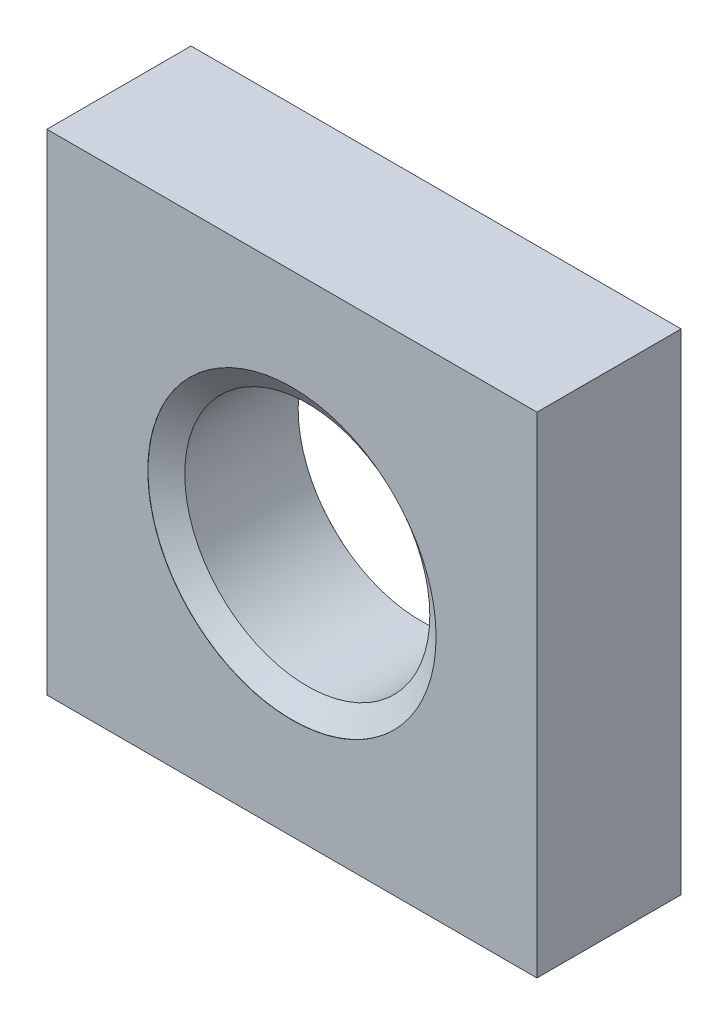
ISO-10303-21;
HEADER;
FILE_DESCRIPTION(('STEP AP214'),'2;1');
FILE_NAME('part.step','',(''),(''),'','','');
FILE_SCHEMA(('AUTOMOTIVE_DESIGN { 1 0 10303 214 1 1 1 1 }'));
ENDSEC;
DATA;
#1=APPLICATION_CONTEXT('core data for automotive mechanical design processes');
#2=APPLICATION_PROTOCOL_DEFINITION('international standard','automotive_design',2000,#1);
#3=PRODUCT_CONTEXT('',#1,'mechanical');
#4=PRODUCT('Part','Part','',(#3));
#5=PRODUCT_RELATED_PRODUCT_CATEGORY('part','',(#4));
#6=PRODUCT_DEFINITION_FORMATION('','',#4);
#7=PRODUCT_DEFINITION_CONTEXT('part definition',#1,'design');
#8=PRODUCT_DEFINITION('design','',#6,#7);
#9=PRODUCT_DEFINITION_SHAPE('','',#8);
#10=(LENGTH_UNIT() NAMED_UNIT(*) SI_UNIT(.MILLI.,.METRE.));
#11=(NAMED_UNIT(*) PLANE_ANGLE_UNIT() SI_UNIT($,.RADIAN.));
#12=(NAMED_UNIT(*) SI_UNIT($,.STERADIAN.) SOLID_ANGLE_UNIT());
#13=UNCERTAINTY_MEASURE_WITH_UNIT(LENGTH_MEASURE(1.E-05),#10,'distance_accuracy_value','');
#14=(GEOMETRIC_REPRESENTATION_CONTEXT(3) GLOBAL_UNCERTAINTY_ASSIGNED_CONTEXT((#13)) GLOBAL_UNIT_ASSIGNED_CONTEXT((#10,
#11,#12)) REPRESENTATION_CONTEXT('',''));
#15=CARTESIAN_POINT('',(0.,0.,0.));
#16=DIRECTION('',(0.,0.,1.));
#17=DIRECTION('',(1.,0.,0.));
#18=AXIS2_PLACEMENT_3D('',#15,#16,#17);
#19=CARTESIAN_POINT('',(0.,0.,-5.));
#20=DIRECTION('',(0.,0.,1.));
#21=DIRECTION('',(1.,0.,0.));
#22=AXIS2_PLACEMENT_3D('',#19,#20,#21);
#23=CYLINDRICAL_SURFACE('',#22,4.25);
#24=CARTESIAN_POINT('',(0.,0.,-0.533155653657278));
#25=DIRECTION('',(0.,0.,1.));
#26=DIRECTION('',(1.,0.,0.));
#27=AXIS2_PLACEMENT_3D('',#24,#25,#26);
#28=CIRCLE('',#27,4.25);
#29=CARTESIAN_POINT('',(4.25,0.,-0.533155653657278));
#30=VERTEX_POINT('',#29);
#31=EDGE_CURVE('E113',#30,#30,#28,.F.);
#32=ORIENTED_EDGE('',*,*,#31,.F.);
#33=EDGE_LOOP('',(#32));
#34=FACE_BOUND('',#33,.T.);
#35=CARTESIAN_POINT('',(0.,0.,-4.46584434634272));
#36=DIRECTION('',(0.,0.,-1.));
#37=DIRECTION('',(-1.,0.,0.));
#38=AXIS2_PLACEMENT_3D('',#35,#36,#37);
#39=CIRCLE('',#38,4.25);
#40=CARTESIAN_POINT('',(-4.25,0.,-4.46584434634272));
#41=VERTEX_POINT('',#40);
#42=EDGE_CURVE('E38',#41,#41,#39,.F.);
#43=ORIENTED_EDGE('',*,*,#42,.F.);
#44=EDGE_LOOP('',(#43));
#45=FACE_BOUND('',#44,.T.);
#46=ADVANCED_FACE('F34',(#34,#45),#23,.F.);
#47=CARTESIAN_POINT('',(-8.5,-8.5,-5.));
#48=DIRECTION('',(-1.,0.,0.));
#49=DIRECTION('',(0.,0.,1.));
#50=AXIS2_PLACEMENT_3D('',#47,#48,#49);
#51=PLANE('',#50);
#52=DIRECTION('',(0.,-1.,0.));
#53=VECTOR('',#52,1.);
#54=CARTESIAN_POINT('',(-8.5,-8.5,0.));
#55=LINE('',#54,#53);
#56=CARTESIAN_POINT('',(-8.5,8.5,0.));
#57=VERTEX_POINT('',#56);
#58=CARTESIAN_POINT('',(-8.5,-8.5,0.));
#59=VERTEX_POINT('',#58);
#60=EDGE_CURVE('E102',#57,#59,#55,.T.);
#61=ORIENTED_EDGE('',*,*,#60,.F.);
#62=DIRECTION('',(0.,0.,1.));
#63=VECTOR('',#62,1.);
#64=CARTESIAN_POINT('',(-8.5,8.5,-5.));
#65=LINE('',#64,#63);
#66=CARTESIAN_POINT('',(-8.5,8.5,-5.));
#67=VERTEX_POINT('',#66);
#68=EDGE_CURVE('E11',#67,#57,#65,.T.);
#69=ORIENTED_EDGE('',*,*,#68,.F.);
#70=DIRECTION('',(0.,-1.,0.));
#71=VECTOR('',#70,1.);
#72=CARTESIAN_POINT('',(-8.5,-8.5,-5.));
#73=LINE('',#72,#71);
#74=CARTESIAN_POINT('',(-8.5,-8.5,-5.));
#75=VERTEX_POINT('',#74);
#76=EDGE_CURVE('E95',#67,#75,#73,.T.);
#77=ORIENTED_EDGE('',*,*,#76,.T.);
#78=DIRECTION('',(0.,0.,1.));
#79=VECTOR('',#78,1.);
#80=CARTESIAN_POINT('',(-8.5,-8.5,-5.));
#81=LINE('',#80,#79);
#82=EDGE_CURVE('E78',#75,#59,#81,.T.);
#83=ORIENTED_EDGE('',*,*,#82,.T.);
#84=EDGE_LOOP('',(#61,#69,#77,#83));
#85=FACE_BOUND('',#84,.T.);
#86=ADVANCED_FACE('F36',(#85),#51,.T.);
#87=CARTESIAN_POINT('',(-8.5,8.5,-5.));
#88=DIRECTION('',(0.,1.,0.));
#89=DIRECTION('',(0.,0.,1.));
#90=AXIS2_PLACEMENT_3D('',#87,#88,#89);
#91=PLANE('',#90);
#92=DIRECTION('',(-1.,0.,0.));
#93=VECTOR('',#92,1.);
#94=CARTESIAN_POINT('',(-8.5,8.5,0.));
#95=LINE('',#94,#93);
#96=CARTESIAN_POINT('',(8.5,8.5,0.));
#97=VERTEX_POINT('',#96);
#98=EDGE_CURVE('E97',#97,#57,#95,.T.);
#99=ORIENTED_EDGE('',*,*,#98,.F.);
#100=DIRECTION('',(0.,0.,1.));
#101=VECTOR('',#100,1.);
#102=CARTESIAN_POINT('',(8.5,8.5,-5.));
#103=LINE('',#102,#101);
#104=CARTESIAN_POINT('',(8.5,8.5,-5.));
#105=VERTEX_POINT('',#104);
#106=EDGE_CURVE('E44',#105,#97,#103,.T.);
#107=ORIENTED_EDGE('',*,*,#106,.F.);
#108=DIRECTION('',(-1.,0.,0.));
#109=VECTOR('',#108,1.);
#110=CARTESIAN_POINT('',(-8.5,8.5,-5.));
#111=LINE('',#110,#109);
#112=EDGE_CURVE('E92',#105,#67,#111,.T.);
#113=ORIENTED_EDGE('',*,*,#112,.T.);
#114=ORIENTED_EDGE('',*,*,#68,.T.);
#115=EDGE_LOOP('',(#99,#107,#113,#114));
#116=FACE_BOUND('',#115,.T.);
#117=ADVANCED_FACE('F144',(#116),#91,.T.);
#118=CARTESIAN_POINT('',(8.5,-8.5,-5.));
#119=DIRECTION('',(1.,0.,0.));
#120=DIRECTION('',(0.,0.,-1.));
#121=AXIS2_PLACEMENT_3D('',#118,#119,#120);
#122=PLANE('',#121);
#123=DIRECTION('',(0.,1.,0.));
#124=VECTOR('',#123,1.);
#125=CARTESIAN_POINT('',(8.5,-8.5,0.));
#126=LINE('',#125,#124);
#127=CARTESIAN_POINT('',(8.5,-8.5,0.));
#128=VERTEX_POINT('',#127);
#129=EDGE_CURVE('E86',#128,#97,#126,.T.);
#130=ORIENTED_EDGE('',*,*,#129,.F.);
#131=DIRECTION('',(0.,0.,1.));
#132=VECTOR('',#131,1.);
#133=CARTESIAN_POINT('',(8.5,-8.5,-5.));
#134=LINE('',#133,#132);
#135=CARTESIAN_POINT('',(8.5,-8.5,-5.));
#136=VERTEX_POINT('',#135);
#137=EDGE_CURVE('E81',#136,#128,#134,.T.);
#138=ORIENTED_EDGE('',*,*,#137,.F.);
#139=DIRECTION('',(0.,1.,0.));
#140=VECTOR('',#139,1.);
#141=CARTESIAN_POINT('',(8.5,-8.5,-5.));
#142=LINE('',#141,#140);
#143=EDGE_CURVE('E84',#136,#105,#142,.T.);
#144=ORIENTED_EDGE('',*,*,#143,.T.);
#145=ORIENTED_EDGE('',*,*,#106,.T.);
#146=EDGE_LOOP('',(#130,#138,#144,#145));
#147=FACE_BOUND('',#146,.T.);
#148=ADVANCED_FACE('F83',(#147),#122,.T.);
#149=CARTESIAN_POINT('',(-8.5,-8.5,-5.));
#150=DIRECTION('',(0.,-1.,0.));
#151=DIRECTION('',(0.,0.,-1.));
#152=AXIS2_PLACEMENT_3D('',#149,#150,#151);
#153=PLANE('',#152);
#154=DIRECTION('',(1.,0.,0.));
#155=VECTOR('',#154,1.);
#156=CARTESIAN_POINT('',(-8.5,-8.5,0.));
#157=LINE('',#156,#155);
#158=EDGE_CURVE('E105',#59,#128,#157,.T.);
#159=ORIENTED_EDGE('',*,*,#158,.F.);
#160=ORIENTED_EDGE('',*,*,#82,.F.);
#161=DIRECTION('',(1.,0.,0.));
#162=VECTOR('',#161,1.);
#163=CARTESIAN_POINT('',(-8.5,-8.5,-5.));
#164=LINE('',#163,#162);
#165=EDGE_CURVE('E91',#75,#136,#164,.T.);
#166=ORIENTED_EDGE('',*,*,#165,.T.);
#167=ORIENTED_EDGE('',*,*,#137,.T.);
#168=EDGE_LOOP('',(#159,#160,#166,#167));
#169=FACE_BOUND('',#168,.T.);
#170=ADVANCED_FACE('F94',(#169),#153,.T.);
#171=CARTESIAN_POINT('',(-8.5,8.5,-5.));
#172=DIRECTION('',(0.,0.,-1.));
#173=DIRECTION('',(-1.,0.,0.));
#174=AXIS2_PLACEMENT_3D('',#171,#172,#173);
#175=PLANE('',#174);
#176=CARTESIAN_POINT('',(0.,0.,-5.));
#177=DIRECTION('',(0.,0.,-1.));
#178=DIRECTION('',(-1.,0.,0.));
#179=AXIS2_PLACEMENT_3D('',#176,#177,#178);
#180=CIRCLE('',#179,5.);
#181=CARTESIAN_POINT('',(-5.,0.,-5.));
#182=VERTEX_POINT('',#181);
#183=EDGE_CURVE('E118',#182,#182,#180,.F.);
#184=ORIENTED_EDGE('',*,*,#183,.T.);
#185=EDGE_LOOP('',(#184));
#186=FACE_BOUND('',#185,.T.);
#187=ORIENTED_EDGE('',*,*,#76,.F.);
#188=ORIENTED_EDGE('',*,*,#112,.F.);
#189=ORIENTED_EDGE('',*,*,#143,.F.);
#190=ORIENTED_EDGE('',*,*,#165,.F.);
#191=EDGE_LOOP('',(#187,#188,#189,#190));
#192=FACE_BOUND('',#191,.T.);
#193=ADVANCED_FACE('F90',(#186,#192),#175,.T.);
#194=CARTESIAN_POINT('',(-8.5,8.5,0.));
#195=DIRECTION('',(0.,0.,-1.));
#196=DIRECTION('',(-1.,0.,0.));
#197=AXIS2_PLACEMENT_3D('',#194,#195,#196);
#198=PLANE('',#197);
#199=CARTESIAN_POINT('',(0.,0.,0.));
#200=DIRECTION('',(0.,0.,-1.));
#201=DIRECTION('',(-1.,0.,0.));
#202=AXIS2_PLACEMENT_3D('',#199,#200,#201);
#203=CIRCLE('',#202,5.);
#204=CARTESIAN_POINT('',(-5.,0.,0.));
#205=VERTEX_POINT('',#204);
#206=EDGE_CURVE('E106',#205,#205,#203,.F.);
#207=ORIENTED_EDGE('',*,*,#206,.F.);
#208=EDGE_LOOP('',(#207));
#209=FACE_BOUND('',#208,.T.);
#210=ORIENTED_EDGE('',*,*,#60,.T.);
#211=ORIENTED_EDGE('',*,*,#158,.T.);
#212=ORIENTED_EDGE('',*,*,#129,.T.);
#213=ORIENTED_EDGE('',*,*,#98,.T.);
#214=EDGE_LOOP('',(#210,#211,#212,#213));
#215=FACE_BOUND('',#214,.T.);
#216=ADVANCED_FACE('F137',(#209,#215),#198,.F.);
#217=CARTESIAN_POINT('',(0.,0.,-25.0375057290932));
#218=DIRECTION('',(0.,0.,1.));
#219=DIRECTION('',(1.,0.,0.));
#220=AXIS2_PLACEMENT_3D('',#217,#218,#219);
#221=CYLINDRICAL_SURFACE('',#220,5.);
#222=CARTESIAN_POINT('',(0.,0.,-0.00799999999999759));
#223=DIRECTION('',(0.,0.,1.));
#224=DIRECTION('',(1.,0.,0.));
#225=AXIS2_PLACEMENT_3D('',#222,#223,#224);
#226=CIRCLE('',#225,5.);
#227=CARTESIAN_POINT('',(5.,0.,-0.00799999999999759));
#228=VERTEX_POINT('',#227);
#229=EDGE_CURVE('E116',#228,#228,#226,.T.);
#230=ORIENTED_EDGE('',*,*,#229,.F.);
#231=EDGE_LOOP('',(#230));
#232=FACE_BOUND('',#231,.T.);
#233=ORIENTED_EDGE('',*,*,#206,.T.);
#234=EDGE_LOOP('',(#233));
#235=FACE_BOUND('',#234,.T.);
#236=ADVANCED_FACE('F134',(#232,#235),#221,.F.);
#237=CARTESIAN_POINT('',(0.,0.,-0.585671219023007));
#238=DIRECTION('',(0.,0.,1.));
#239=DIRECTION('',(1.,0.,0.));
#240=AXIS2_PLACEMENT_3D('',#237,#238,#239);
#241=CONICAL_SURFACE('',#240,4.175,0.959931088596882);
#242=ORIENTED_EDGE('',*,*,#229,.T.);
#243=EDGE_LOOP('',(#242));
#244=FACE_BOUND('',#243,.T.);
#245=ORIENTED_EDGE('',*,*,#31,.T.);
#246=EDGE_LOOP('',(#245));
#247=FACE_BOUND('',#246,.T.);
#248=ADVANCED_FACE('F131',(#244,#247),#241,.F.);
#249=CARTESIAN_POINT('',(0.,0.,-4.991));
#250=DIRECTION('',(0.,0.,-1.));
#251=DIRECTION('',(-1.,0.,0.));
#252=AXIS2_PLACEMENT_3D('',#249,#250,#251);
#253=CONICAL_SURFACE('',#252,5.,0.959931088596881);
#254=CARTESIAN_POINT('',(0.,0.,-4.991));
#255=DIRECTION('',(0.,0.,1.));
#256=DIRECTION('',(1.,0.,0.));
#257=AXIS2_PLACEMENT_3D('',#254,#255,#256);
#258=CIRCLE('',#257,5.);
#259=CARTESIAN_POINT('',(5.,0.,-4.991));
#260=VERTEX_POINT('',#259);
#261=EDGE_CURVE('E120',#260,#260,#258,.T.);
#262=ORIENTED_EDGE('',*,*,#261,.F.);
#263=EDGE_LOOP('',(#262));
#264=FACE_BOUND('',#263,.T.);
#265=ORIENTED_EDGE('',*,*,#42,.T.);
#266=EDGE_LOOP('',(#265));
#267=FACE_BOUND('',#266,.T.);
#268=ADVANCED_FACE('F212',(#264,#267),#253,.F.);
#269=CARTESIAN_POINT('',(0.,0.,-25.0375057290932));
#270=DIRECTION('',(0.,0.,1.));
#271=DIRECTION('',(1.,0.,0.));
#272=AXIS2_PLACEMENT_3D('',#269,#270,#271);
#273=CYLINDRICAL_SURFACE('',#272,5.);
#274=ORIENTED_EDGE('',*,*,#183,.F.);
#275=EDGE_LOOP('',(#274));
#276=FACE_BOUND('',#275,.T.);
#277=ORIENTED_EDGE('',*,*,#261,.T.);
#278=EDGE_LOOP('',(#277));
#279=FACE_BOUND('',#278,.T.);
#280=ADVANCED_FACE('F219',(#276,#279),#273,.F.);
#281=CLOSED_SHELL('',(#46,#86,#117,#148,#170,#193,#216,#236,#248,#268,#280));
#282=MANIFOLD_SOLID_BREP('B2',#281);
#283=ADVANCED_BREP_SHAPE_REPRESENTATION('',(#18,#282),#14);
#284=SHAPE_DEFINITION_REPRESENTATION(#9,#283);
ENDSEC;
END-ISO-10303-21;
